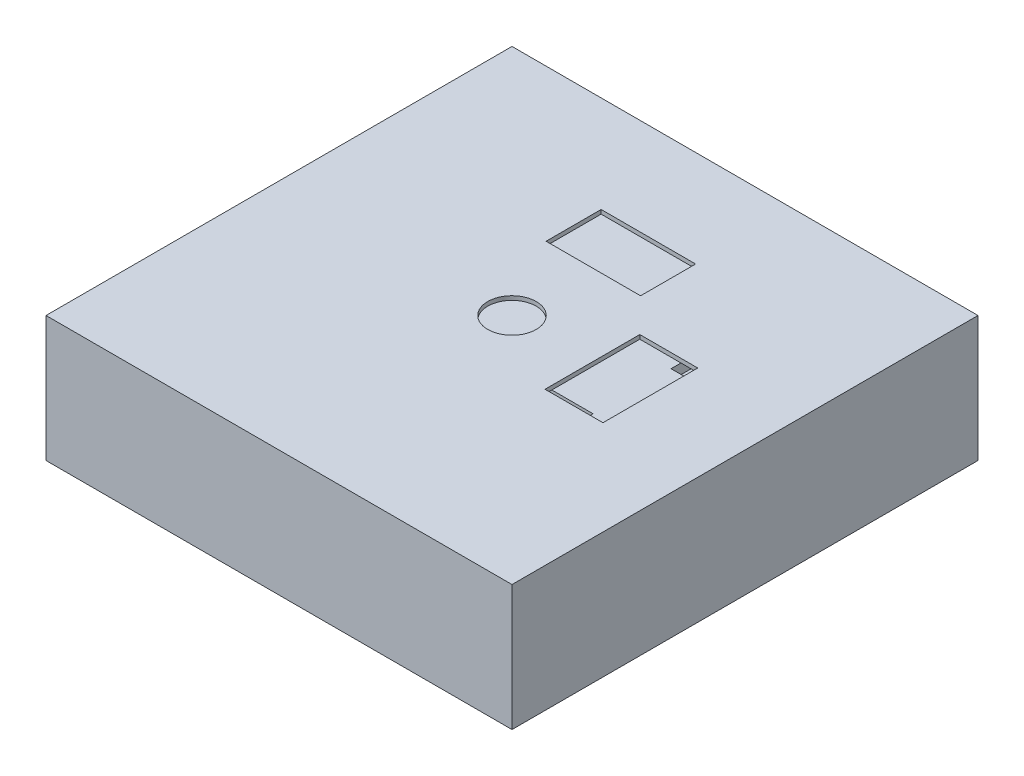
ISO-10303-21;
HEADER;
FILE_DESCRIPTION(('STEP AP214'),'2;1');
FILE_NAME('part.step','',(''),(''),'','','');
FILE_SCHEMA(('AUTOMOTIVE_DESIGN { 1 0 10303 214 1 1 1 1 }'));
ENDSEC;
DATA;
#1=APPLICATION_CONTEXT('core data for automotive mechanical design processes');
#2=APPLICATION_PROTOCOL_DEFINITION('international standard','automotive_design',2000,#1);
#3=PRODUCT_CONTEXT('',#1,'mechanical');
#4=PRODUCT('Part','Part','',(#3));
#5=PRODUCT_RELATED_PRODUCT_CATEGORY('part','',(#4));
#6=PRODUCT_DEFINITION_FORMATION('','',#4);
#7=PRODUCT_DEFINITION_CONTEXT('part definition',#1,'design');
#8=PRODUCT_DEFINITION('design','',#6,#7);
#9=PRODUCT_DEFINITION_SHAPE('','',#8);
#10=(LENGTH_UNIT() NAMED_UNIT(*) SI_UNIT(.MILLI.,.METRE.));
#11=(NAMED_UNIT(*) PLANE_ANGLE_UNIT() SI_UNIT($,.RADIAN.));
#12=(NAMED_UNIT(*) SI_UNIT($,.STERADIAN.) SOLID_ANGLE_UNIT());
#13=UNCERTAINTY_MEASURE_WITH_UNIT(LENGTH_MEASURE(1.E-05),#10,'distance_accuracy_value','');
#14=(GEOMETRIC_REPRESENTATION_CONTEXT(3) GLOBAL_UNCERTAINTY_ASSIGNED_CONTEXT((#13)) GLOBAL_UNIT_ASSIGNED_CONTEXT((#10,
#11,#12)) REPRESENTATION_CONTEXT('',''));
#15=CARTESIAN_POINT('',(0.,0.,0.));
#16=DIRECTION('',(0.,0.,1.));
#17=DIRECTION('',(1.,0.,0.));
#18=AXIS2_PLACEMENT_3D('',#15,#16,#17);
#19=CARTESIAN_POINT('',(0.,20.,0.));
#20=DIRECTION('',(0.,1.,0.));
#21=DIRECTION('',(0.,0.,1.));
#22=AXIS2_PLACEMENT_3D('',#19,#20,#21);
#23=PLANE('',#22);
#24=DIRECTION('',(0.,0.,-1.));
#25=VECTOR('',#24,1.);
#26=CARTESIAN_POINT('',(110.,20.,0.));
#27=LINE('',#26,#25);
#28=CARTESIAN_POINT('',(110.,20.,110.));
#29=VERTEX_POINT('',#28);
#30=CARTESIAN_POINT('',(110.,20.,-110.));
#31=VERTEX_POINT('',#30);
#32=EDGE_CURVE('E294',#29,#31,#27,.T.);
#33=ORIENTED_EDGE('',*,*,#32,.T.);
#34=DIRECTION('',(1.,0.,0.));
#35=VECTOR('',#34,1.);
#36=CARTESIAN_POINT('',(0.,20.,-110.));
#37=LINE('',#36,#35);
#38=CARTESIAN_POINT('',(-110.,20.,-110.));
#39=VERTEX_POINT('',#38);
#40=EDGE_CURVE('E298',#39,#31,#37,.T.);
#41=ORIENTED_EDGE('',*,*,#40,.F.);
#42=DIRECTION('',(0.,0.,-1.));
#43=VECTOR('',#42,1.);
#44=CARTESIAN_POINT('',(-110.,20.,0.));
#45=LINE('',#44,#43);
#46=CARTESIAN_POINT('',(-110.,20.,110.));
#47=VERTEX_POINT('',#46);
#48=EDGE_CURVE('E312',#47,#39,#45,.T.);
#49=ORIENTED_EDGE('',*,*,#48,.F.);
#50=DIRECTION('',(-1.,0.,0.));
#51=VECTOR('',#50,1.);
#52=CARTESIAN_POINT('',(0.,20.,110.));
#53=LINE('',#52,#51);
#54=EDGE_CURVE('E310',#29,#47,#53,.T.);
#55=ORIENTED_EDGE('',*,*,#54,.F.);
#56=EDGE_LOOP('',(#33,#41,#49,#55));
#57=FACE_BOUND('',#56,.T.);
#58=DIRECTION('',(0.,0.,1.));
#59=VECTOR('',#58,1.);
#60=CARTESIAN_POINT('',(-20.0000000000001,20.,-20.));
#61=LINE('',#60,#59);
#62=CARTESIAN_POINT('',(-20.0000000000001,20.,-20.));
#63=VERTEX_POINT('',#62);
#64=CARTESIAN_POINT('',(-20.0000000000001,20.,20.));
#65=VERTEX_POINT('',#64);
#66=EDGE_CURVE('E386',#63,#65,#61,.T.);
#67=ORIENTED_EDGE('',*,*,#66,.F.);
#68=DIRECTION('',(-1.,0.,0.));
#69=VECTOR('',#68,1.);
#70=CARTESIAN_POINT('',(-20.0000000000001,20.,-20.));
#71=LINE('',#70,#69);
#72=CARTESIAN_POINT('',(19.9999999999999,20.,-20.));
#73=VERTEX_POINT('',#72);
#74=EDGE_CURVE('E417',#73,#63,#71,.T.);
#75=ORIENTED_EDGE('',*,*,#74,.F.);
#76=DIRECTION('',(0.,0.,-1.));
#77=VECTOR('',#76,1.);
#78=CARTESIAN_POINT('',(19.9999999999999,20.,-20.));
#79=LINE('',#78,#77);
#80=CARTESIAN_POINT('',(19.9999999999999,20.,20.));
#81=VERTEX_POINT('',#80);
#82=EDGE_CURVE('E420',#81,#73,#79,.T.);
#83=ORIENTED_EDGE('',*,*,#82,.F.);
#84=DIRECTION('',(1.,0.,0.));
#85=VECTOR('',#84,1.);
#86=CARTESIAN_POINT('',(-20.0000000000001,20.,20.));
#87=LINE('',#86,#85);
#88=EDGE_CURVE('E423',#65,#81,#87,.T.);
#89=ORIENTED_EDGE('',*,*,#88,.F.);
#90=EDGE_LOOP('',(#67,#75,#83,#89));
#91=FACE_BOUND('',#90,.T.);
#92=DIRECTION('',(0.,0.,1.));
#93=VECTOR('',#92,1.);
#94=CARTESIAN_POINT('',(58.4999999999999,20.,20.));
#95=LINE('',#94,#93);
#96=CARTESIAN_POINT('',(58.4999999999999,20.,20.));
#97=VERTEX_POINT('',#96);
#98=CARTESIAN_POINT('',(58.4999999999999,20.,35.));
#99=VERTEX_POINT('',#98);
#100=EDGE_CURVE('E363',#97,#99,#95,.T.);
#101=ORIENTED_EDGE('',*,*,#100,.F.);
#102=DIRECTION('',(-1.,0.,0.));
#103=VECTOR('',#102,1.);
#104=CARTESIAN_POINT('',(58.4999999999999,20.,20.));
#105=LINE('',#104,#103);
#106=CARTESIAN_POINT('',(88.4999999999999,20.,20.));
#107=VERTEX_POINT('',#106);
#108=EDGE_CURVE('E387',#107,#97,#105,.T.);
#109=ORIENTED_EDGE('',*,*,#108,.F.);
#110=DIRECTION('',(0.,0.,-1.));
#111=VECTOR('',#110,1.);
#112=CARTESIAN_POINT('',(88.4999999999999,20.,20.));
#113=LINE('',#112,#111);
#114=CARTESIAN_POINT('',(88.4999999999999,20.,35.));
#115=VERTEX_POINT('',#114);
#116=EDGE_CURVE('E390',#115,#107,#113,.T.);
#117=ORIENTED_EDGE('',*,*,#116,.F.);
#118=DIRECTION('',(1.,0.,0.));
#119=VECTOR('',#118,1.);
#120=CARTESIAN_POINT('',(58.4999999999999,20.,35.));
#121=LINE('',#120,#119);
#122=EDGE_CURVE('E394',#99,#115,#121,.T.);
#123=ORIENTED_EDGE('',*,*,#122,.F.);
#124=EDGE_LOOP('',(#101,#109,#117,#123));
#125=FACE_BOUND('',#124,.T.);
#126=DIRECTION('',(0.,0.,1.));
#127=VECTOR('',#126,1.);
#128=CARTESIAN_POINT('',(19.9999999999999,20.,-88.5));
#129=LINE('',#128,#127);
#130=CARTESIAN_POINT('',(19.9999999999999,20.,-88.5));
#131=VERTEX_POINT('',#130);
#132=CARTESIAN_POINT('',(20.,20.,-58.5));
#133=VERTEX_POINT('',#132);
#134=EDGE_CURVE('E360',#131,#133,#129,.T.);
#135=ORIENTED_EDGE('',*,*,#134,.F.);
#136=DIRECTION('',(-1.,0.,0.));
#137=VECTOR('',#136,1.);
#138=CARTESIAN_POINT('',(19.9999999999999,20.,-88.5));
#139=LINE('',#138,#137);
#140=CARTESIAN_POINT('',(35.,20.,-88.5));
#141=VERTEX_POINT('',#140);
#142=EDGE_CURVE('E350',#141,#131,#139,.T.);
#143=ORIENTED_EDGE('',*,*,#142,.F.);
#144=DIRECTION('',(0.,0.,-1.));
#145=VECTOR('',#144,1.);
#146=CARTESIAN_POINT('',(35.,20.,-88.5));
#147=LINE('',#146,#145);
#148=CARTESIAN_POINT('',(35.,20.,-58.5));
#149=VERTEX_POINT('',#148);
#150=EDGE_CURVE('E366',#149,#141,#147,.T.);
#151=ORIENTED_EDGE('',*,*,#150,.F.);
#152=DIRECTION('',(1.,0.,0.));
#153=VECTOR('',#152,1.);
#154=CARTESIAN_POINT('',(20.,20.,-58.5));
#155=LINE('',#154,#153);
#156=EDGE_CURVE('E362',#133,#149,#155,.T.);
#157=ORIENTED_EDGE('',*,*,#156,.F.);
#158=EDGE_LOOP('',(#135,#143,#151,#157));
#159=FACE_BOUND('',#158,.T.);
#160=ADVANCED_FACE('F39',(#57,#91,#125,#159),#23,.T.);
#161=CARTESIAN_POINT('',(-20.0000000000001,15.,-20.));
#162=DIRECTION('',(-1.,0.,0.));
#163=DIRECTION('',(0.,0.,1.));
#164=AXIS2_PLACEMENT_3D('',#161,#162,#163);
#165=PLANE('',#164);
#166=ORIENTED_EDGE('',*,*,#66,.T.);
#167=DIRECTION('',(0.,1.,0.));
#168=VECTOR('',#167,1.);
#169=CARTESIAN_POINT('',(-20.0000000000001,15.,20.));
#170=LINE('',#169,#168);
#171=CARTESIAN_POINT('',(-20.0000000000001,15.,20.));
#172=VERTEX_POINT('',#171);
#173=EDGE_CURVE('E408',#172,#65,#170,.T.);
#174=ORIENTED_EDGE('',*,*,#173,.F.);
#175=DIRECTION('',(0.,0.,1.));
#176=VECTOR('',#175,1.);
#177=CARTESIAN_POINT('',(-20.0000000000001,15.,-20.));
#178=LINE('',#177,#176);
#179=CARTESIAN_POINT('',(-20.0000000000001,15.,-20.));
#180=VERTEX_POINT('',#179);
#181=EDGE_CURVE('E43',#180,#172,#178,.T.);
#182=ORIENTED_EDGE('',*,*,#181,.F.);
#183=DIRECTION('',(0.,1.,0.));
#184=VECTOR('',#183,1.);
#185=CARTESIAN_POINT('',(-20.0000000000001,15.,-20.));
#186=LINE('',#185,#184);
#187=EDGE_CURVE('E338',#180,#63,#186,.T.);
#188=ORIENTED_EDGE('',*,*,#187,.T.);
#189=EDGE_LOOP('',(#166,#174,#182,#188));
#190=FACE_BOUND('',#189,.T.);
#191=ADVANCED_FACE('F440',(#190),#165,.F.);
#192=CARTESIAN_POINT('',(-20.0000000000001,15.,-20.));
#193=DIRECTION('',(0.,0.,-1.));
#194=DIRECTION('',(-1.,0.,0.));
#195=AXIS2_PLACEMENT_3D('',#192,#193,#194);
#196=PLANE('',#195);
#197=ORIENTED_EDGE('',*,*,#74,.T.);
#198=ORIENTED_EDGE('',*,*,#187,.F.);
#199=DIRECTION('',(-1.,0.,0.));
#200=VECTOR('',#199,1.);
#201=CARTESIAN_POINT('',(-20.0000000000001,15.,-20.));
#202=LINE('',#201,#200);
#203=CARTESIAN_POINT('',(19.9999999999999,15.,-20.));
#204=VERTEX_POINT('',#203);
#205=EDGE_CURVE('E411',#204,#180,#202,.T.);
#206=ORIENTED_EDGE('',*,*,#205,.F.);
#207=DIRECTION('',(0.,1.,0.));
#208=VECTOR('',#207,1.);
#209=CARTESIAN_POINT('',(19.9999999999999,15.,-20.));
#210=LINE('',#209,#208);
#211=EDGE_CURVE('E414',#204,#73,#210,.T.);
#212=ORIENTED_EDGE('',*,*,#211,.T.);
#213=EDGE_LOOP('',(#197,#198,#206,#212));
#214=FACE_BOUND('',#213,.T.);
#215=ADVANCED_FACE('F450',(#214),#196,.F.);
#216=CARTESIAN_POINT('',(19.9999999999999,15.,-20.));
#217=DIRECTION('',(1.,0.,0.));
#218=DIRECTION('',(0.,0.,-1.));
#219=AXIS2_PLACEMENT_3D('',#216,#217,#218);
#220=PLANE('',#219);
#221=ORIENTED_EDGE('',*,*,#82,.T.);
#222=ORIENTED_EDGE('',*,*,#211,.F.);
#223=DIRECTION('',(0.,0.,-1.));
#224=VECTOR('',#223,1.);
#225=CARTESIAN_POINT('',(19.9999999999999,15.,-20.));
#226=LINE('',#225,#224);
#227=CARTESIAN_POINT('',(19.9999999999999,15.,20.));
#228=VERTEX_POINT('',#227);
#229=EDGE_CURVE('E429',#228,#204,#226,.T.);
#230=ORIENTED_EDGE('',*,*,#229,.F.);
#231=DIRECTION('',(0.,1.,0.));
#232=VECTOR('',#231,1.);
#233=CARTESIAN_POINT('',(19.9999999999999,15.,20.));
#234=LINE('',#233,#232);
#235=EDGE_CURVE('E412',#228,#81,#234,.T.);
#236=ORIENTED_EDGE('',*,*,#235,.T.);
#237=EDGE_LOOP('',(#221,#222,#230,#236));
#238=FACE_BOUND('',#237,.T.);
#239=ADVANCED_FACE('F448',(#238),#220,.F.);
#240=CARTESIAN_POINT('',(-20.0000000000001,15.,20.));
#241=DIRECTION('',(0.,0.,1.));
#242=DIRECTION('',(1.,0.,0.));
#243=AXIS2_PLACEMENT_3D('',#240,#241,#242);
#244=PLANE('',#243);
#245=ORIENTED_EDGE('',*,*,#88,.T.);
#246=ORIENTED_EDGE('',*,*,#235,.F.);
#247=DIRECTION('',(1.,0.,0.));
#248=VECTOR('',#247,1.);
#249=CARTESIAN_POINT('',(-20.0000000000001,15.,20.));
#250=LINE('',#249,#248);
#251=EDGE_CURVE('E431',#172,#228,#250,.T.);
#252=ORIENTED_EDGE('',*,*,#251,.F.);
#253=ORIENTED_EDGE('',*,*,#173,.T.);
#254=EDGE_LOOP('',(#245,#246,#252,#253));
#255=FACE_BOUND('',#254,.T.);
#256=ADVANCED_FACE('F444',(#255),#244,.F.);
#257=CARTESIAN_POINT('',(0.,15.,0.));
#258=DIRECTION('',(0.,1.,0.));
#259=DIRECTION('',(0.,0.,1.));
#260=AXIS2_PLACEMENT_3D('',#257,#258,#259);
#261=PLANE('',#260);
#262=ORIENTED_EDGE('',*,*,#181,.T.);
#263=ORIENTED_EDGE('',*,*,#251,.T.);
#264=ORIENTED_EDGE('',*,*,#229,.T.);
#265=ORIENTED_EDGE('',*,*,#205,.T.);
#266=EDGE_LOOP('',(#262,#263,#264,#265));
#267=FACE_BOUND('',#266,.T.);
#268=ADVANCED_FACE('F437',(#267),#261,.T.);
#269=CARTESIAN_POINT('',(58.4999999999999,15.,20.));
#270=DIRECTION('',(-1.,0.,0.));
#271=DIRECTION('',(0.,0.,1.));
#272=AXIS2_PLACEMENT_3D('',#269,#270,#271);
#273=PLANE('',#272);
#274=ORIENTED_EDGE('',*,*,#100,.T.);
#275=DIRECTION('',(0.,1.,0.));
#276=VECTOR('',#275,1.);
#277=CARTESIAN_POINT('',(58.4999999999999,15.,35.));
#278=LINE('',#277,#276);
#279=CARTESIAN_POINT('',(58.4999999999999,15.,35.));
#280=VERTEX_POINT('',#279);
#281=EDGE_CURVE('E376',#280,#99,#278,.T.);
#282=ORIENTED_EDGE('',*,*,#281,.F.);
#283=DIRECTION('',(0.,0.,1.));
#284=VECTOR('',#283,1.);
#285=CARTESIAN_POINT('',(58.4999999999999,15.,20.));
#286=LINE('',#285,#284);
#287=CARTESIAN_POINT('',(58.4999999999999,15.,20.));
#288=VERTEX_POINT('',#287);
#289=EDGE_CURVE('E391',#288,#280,#286,.T.);
#290=ORIENTED_EDGE('',*,*,#289,.F.);
#291=DIRECTION('',(0.,1.,0.));
#292=VECTOR('',#291,1.);
#293=CARTESIAN_POINT('',(58.4999999999999,15.,20.));
#294=LINE('',#293,#292);
#295=EDGE_CURVE('E384',#288,#97,#294,.T.);
#296=ORIENTED_EDGE('',*,*,#295,.T.);
#297=EDGE_LOOP('',(#274,#282,#290,#296));
#298=FACE_BOUND('',#297,.T.);
#299=ADVANCED_FACE('F491',(#298),#273,.F.);
#300=CARTESIAN_POINT('',(58.4999999999999,15.,20.));
#301=DIRECTION('',(0.,0.,-1.));
#302=DIRECTION('',(-1.,0.,0.));
#303=AXIS2_PLACEMENT_3D('',#300,#301,#302);
#304=PLANE('',#303);
#305=ORIENTED_EDGE('',*,*,#108,.T.);
#306=ORIENTED_EDGE('',*,*,#295,.F.);
#307=DIRECTION('',(-1.,0.,0.));
#308=VECTOR('',#307,1.);
#309=CARTESIAN_POINT('',(58.4999999999999,15.,20.));
#310=LINE('',#309,#308);
#311=CARTESIAN_POINT('',(88.4999999999999,15.,20.));
#312=VERTEX_POINT('',#311);
#313=EDGE_CURVE('E379',#312,#288,#310,.T.);
#314=ORIENTED_EDGE('',*,*,#313,.F.);
#315=DIRECTION('',(0.,1.,0.));
#316=VECTOR('',#315,1.);
#317=CARTESIAN_POINT('',(88.4999999999999,15.,20.));
#318=LINE('',#317,#316);
#319=EDGE_CURVE('E382',#312,#107,#318,.T.);
#320=ORIENTED_EDGE('',*,*,#319,.T.);
#321=EDGE_LOOP('',(#305,#306,#314,#320));
#322=FACE_BOUND('',#321,.T.);
#323=ADVANCED_FACE('F494',(#322),#304,.F.);
#324=CARTESIAN_POINT('',(88.4999999999999,15.,20.));
#325=DIRECTION('',(1.,0.,0.));
#326=DIRECTION('',(0.,0.,-1.));
#327=AXIS2_PLACEMENT_3D('',#324,#325,#326);
#328=PLANE('',#327);
#329=ORIENTED_EDGE('',*,*,#116,.T.);
#330=ORIENTED_EDGE('',*,*,#319,.F.);
#331=DIRECTION('',(0.,0.,-1.));
#332=VECTOR('',#331,1.);
#333=CARTESIAN_POINT('',(88.4999999999999,15.,20.));
#334=LINE('',#333,#332);
#335=CARTESIAN_POINT('',(88.4999999999999,15.,35.));
#336=VERTEX_POINT('',#335);
#337=EDGE_CURVE('E400',#336,#312,#334,.T.);
#338=ORIENTED_EDGE('',*,*,#337,.F.);
#339=DIRECTION('',(0.,1.,0.));
#340=VECTOR('',#339,1.);
#341=CARTESIAN_POINT('',(88.4999999999999,15.,35.));
#342=LINE('',#341,#340);
#343=EDGE_CURVE('E380',#336,#115,#342,.T.);
#344=ORIENTED_EDGE('',*,*,#343,.T.);
#345=EDGE_LOOP('',(#329,#330,#338,#344));
#346=FACE_BOUND('',#345,.T.);
#347=ADVANCED_FACE('F499',(#346),#328,.F.);
#348=CARTESIAN_POINT('',(58.4999999999999,15.,35.));
#349=DIRECTION('',(0.,0.,1.));
#350=DIRECTION('',(1.,0.,0.));
#351=AXIS2_PLACEMENT_3D('',#348,#349,#350);
#352=PLANE('',#351);
#353=ORIENTED_EDGE('',*,*,#122,.T.);
#354=ORIENTED_EDGE('',*,*,#343,.F.);
#355=DIRECTION('',(1.,0.,0.));
#356=VECTOR('',#355,1.);
#357=CARTESIAN_POINT('',(58.4999999999999,15.,35.));
#358=LINE('',#357,#356);
#359=EDGE_CURVE('E403',#280,#336,#358,.T.);
#360=ORIENTED_EDGE('',*,*,#359,.F.);
#361=ORIENTED_EDGE('',*,*,#281,.T.);
#362=EDGE_LOOP('',(#353,#354,#360,#361));
#363=FACE_BOUND('',#362,.T.);
#364=ADVANCED_FACE('F496',(#363),#352,.F.);
#365=CARTESIAN_POINT('',(0.,15.,0.));
#366=DIRECTION('',(0.,1.,0.));
#367=DIRECTION('',(0.,0.,1.));
#368=AXIS2_PLACEMENT_3D('',#365,#366,#367);
#369=PLANE('',#368);
#370=ORIENTED_EDGE('',*,*,#289,.T.);
#371=ORIENTED_EDGE('',*,*,#359,.T.);
#372=ORIENTED_EDGE('',*,*,#337,.T.);
#373=ORIENTED_EDGE('',*,*,#313,.T.);
#374=EDGE_LOOP('',(#370,#371,#372,#373));
#375=FACE_BOUND('',#374,.T.);
#376=ADVANCED_FACE('F490',(#375),#369,.T.);
#377=CARTESIAN_POINT('',(19.9999999999999,15.,-88.5));
#378=DIRECTION('',(-1.,0.,0.));
#379=DIRECTION('',(0.,0.,1.));
#380=AXIS2_PLACEMENT_3D('',#377,#378,#379);
#381=PLANE('',#380);
#382=ORIENTED_EDGE('',*,*,#134,.T.);
#383=DIRECTION('',(0.,1.,0.));
#384=VECTOR('',#383,1.);
#385=CARTESIAN_POINT('',(20.,15.,-58.5));
#386=LINE('',#385,#384);
#387=CARTESIAN_POINT('',(20.,15.,-58.5));
#388=VERTEX_POINT('',#387);
#389=EDGE_CURVE('E359',#388,#133,#386,.T.);
#390=ORIENTED_EDGE('',*,*,#389,.F.);
#391=DIRECTION('',(0.,0.,1.));
#392=VECTOR('',#391,1.);
#393=CARTESIAN_POINT('',(19.9999999999999,15.,-88.5));
#394=LINE('',#393,#392);
#395=CARTESIAN_POINT('',(19.9999999999999,15.,-88.5));
#396=VERTEX_POINT('',#395);
#397=EDGE_CURVE('E346',#396,#388,#394,.T.);
#398=ORIENTED_EDGE('',*,*,#397,.F.);
#399=DIRECTION('',(0.,1.,0.));
#400=VECTOR('',#399,1.);
#401=CARTESIAN_POINT('',(19.9999999999999,15.,-88.5));
#402=LINE('',#401,#400);
#403=EDGE_CURVE('E11',#396,#131,#402,.T.);
#404=ORIENTED_EDGE('',*,*,#403,.T.);
#405=EDGE_LOOP('',(#382,#390,#398,#404));
#406=FACE_BOUND('',#405,.T.);
#407=ADVANCED_FACE('F465',(#406),#381,.F.);
#408=CARTESIAN_POINT('',(19.9999999999999,15.,-88.5));
#409=DIRECTION('',(0.,0.,-1.));
#410=DIRECTION('',(-1.,0.,0.));
#411=AXIS2_PLACEMENT_3D('',#408,#409,#410);
#412=PLANE('',#411);
#413=ORIENTED_EDGE('',*,*,#142,.T.);
#414=ORIENTED_EDGE('',*,*,#403,.F.);
#415=DIRECTION('',(-1.,0.,0.));
#416=VECTOR('',#415,1.);
#417=CARTESIAN_POINT('',(19.9999999999999,15.,-88.5));
#418=LINE('',#417,#416);
#419=CARTESIAN_POINT('',(35.,15.,-88.5));
#420=VERTEX_POINT('',#419);
#421=EDGE_CURVE('E356',#420,#396,#418,.T.);
#422=ORIENTED_EDGE('',*,*,#421,.F.);
#423=DIRECTION('',(0.,1.,0.));
#424=VECTOR('',#423,1.);
#425=CARTESIAN_POINT('',(35.,15.,-88.5));
#426=LINE('',#425,#424);
#427=EDGE_CURVE('E48',#420,#141,#426,.T.);
#428=ORIENTED_EDGE('',*,*,#427,.T.);
#429=EDGE_LOOP('',(#413,#414,#422,#428));
#430=FACE_BOUND('',#429,.T.);
#431=ADVANCED_FACE('F475',(#430),#412,.F.);
#432=CARTESIAN_POINT('',(35.,15.,-88.5));
#433=DIRECTION('',(1.,0.,0.));
#434=DIRECTION('',(0.,0.,-1.));
#435=AXIS2_PLACEMENT_3D('',#432,#433,#434);
#436=PLANE('',#435);
#437=ORIENTED_EDGE('',*,*,#150,.T.);
#438=ORIENTED_EDGE('',*,*,#427,.F.);
#439=DIRECTION('',(0.,0.,-1.));
#440=VECTOR('',#439,1.);
#441=CARTESIAN_POINT('',(35.,15.,-88.5));
#442=LINE('',#441,#440);
#443=CARTESIAN_POINT('',(35.,15.,-58.5));
#444=VERTEX_POINT('',#443);
#445=EDGE_CURVE('E353',#444,#420,#442,.T.);
#446=ORIENTED_EDGE('',*,*,#445,.F.);
#447=DIRECTION('',(0.,1.,0.));
#448=VECTOR('',#447,1.);
#449=CARTESIAN_POINT('',(35.,15.,-58.5));
#450=LINE('',#449,#448);
#451=EDGE_CURVE('E372',#444,#149,#450,.T.);
#452=ORIENTED_EDGE('',*,*,#451,.T.);
#453=EDGE_LOOP('',(#437,#438,#446,#452));
#454=FACE_BOUND('',#453,.T.);
#455=ADVANCED_FACE('F477',(#454),#436,.F.);
#456=CARTESIAN_POINT('',(20.,15.,-58.5));
#457=DIRECTION('',(0.,0.,1.));
#458=DIRECTION('',(1.,0.,0.));
#459=AXIS2_PLACEMENT_3D('',#456,#457,#458);
#460=PLANE('',#459);
#461=ORIENTED_EDGE('',*,*,#156,.T.);
#462=ORIENTED_EDGE('',*,*,#451,.F.);
#463=DIRECTION('',(1.,0.,0.));
#464=VECTOR('',#463,1.);
#465=CARTESIAN_POINT('',(20.,15.,-58.5));
#466=LINE('',#465,#464);
#467=EDGE_CURVE('E349',#388,#444,#466,.T.);
#468=ORIENTED_EDGE('',*,*,#467,.F.);
#469=ORIENTED_EDGE('',*,*,#389,.T.);
#470=EDGE_LOOP('',(#461,#462,#468,#469));
#471=FACE_BOUND('',#470,.T.);
#472=ADVANCED_FACE('F469',(#471),#460,.F.);
#473=CARTESIAN_POINT('',(0.,15.,0.));
#474=DIRECTION('',(0.,1.,0.));
#475=DIRECTION('',(0.,0.,1.));
#476=AXIS2_PLACEMENT_3D('',#473,#474,#475);
#477=PLANE('',#476);
#478=ORIENTED_EDGE('',*,*,#397,.T.);
#479=ORIENTED_EDGE('',*,*,#467,.T.);
#480=ORIENTED_EDGE('',*,*,#445,.T.);
#481=ORIENTED_EDGE('',*,*,#421,.T.);
#482=EDGE_LOOP('',(#478,#479,#480,#481));
#483=FACE_BOUND('',#482,.T.);
#484=ADVANCED_FACE('F472',(#483),#477,.T.);
#485=CARTESIAN_POINT('',(110.,60.,0.));
#486=DIRECTION('',(-1.,0.,0.));
#487=DIRECTION('',(0.,0.,1.));
#488=AXIS2_PLACEMENT_3D('',#485,#486,#487);
#489=PLANE('',#488);
#490=ORIENTED_EDGE('',*,*,#32,.F.);
#491=DIRECTION('',(0.,-1.,0.));
#492=VECTOR('',#491,1.);
#493=CARTESIAN_POINT('',(110.,60.,110.));
#494=LINE('',#493,#492);
#495=CARTESIAN_POINT('',(110.,60.,110.));
#496=VERTEX_POINT('',#495);
#497=EDGE_CURVE('E323',#496,#29,#494,.T.);
#498=ORIENTED_EDGE('',*,*,#497,.F.);
#499=DIRECTION('',(0.,0.,-1.));
#500=VECTOR('',#499,1.);
#501=CARTESIAN_POINT('',(110.,60.,0.));
#502=LINE('',#501,#500);
#503=CARTESIAN_POINT('',(110.,60.,-110.));
#504=VERTEX_POINT('',#503);
#505=EDGE_CURVE('E295',#496,#504,#502,.T.);
#506=ORIENTED_EDGE('',*,*,#505,.T.);
#507=DIRECTION('',(0.,-1.,0.));
#508=VECTOR('',#507,1.);
#509=CARTESIAN_POINT('',(110.,60.,-110.));
#510=LINE('',#509,#508);
#511=EDGE_CURVE('E307',#504,#31,#510,.T.);
#512=ORIENTED_EDGE('',*,*,#511,.T.);
#513=EDGE_LOOP('',(#490,#498,#506,#512));
#514=FACE_BOUND('',#513,.T.);
#515=ADVANCED_FACE('F578',(#514),#489,.T.);
#516=CARTESIAN_POINT('',(0.,60.,110.));
#517=DIRECTION('',(0.,0.,1.));
#518=DIRECTION('',(1.,0.,0.));
#519=AXIS2_PLACEMENT_3D('',#516,#517,#518);
#520=PLANE('',#519);
#521=ORIENTED_EDGE('',*,*,#54,.T.);
#522=DIRECTION('',(0.,-1.,0.));
#523=VECTOR('',#522,1.);
#524=CARTESIAN_POINT('',(-110.,60.,110.));
#525=LINE('',#524,#523);
#526=CARTESIAN_POINT('',(-110.,60.,110.));
#527=VERTEX_POINT('',#526);
#528=EDGE_CURVE('E320',#527,#47,#525,.T.);
#529=ORIENTED_EDGE('',*,*,#528,.F.);
#530=DIRECTION('',(-1.,0.,0.));
#531=VECTOR('',#530,1.);
#532=CARTESIAN_POINT('',(0.,60.,110.));
#533=LINE('',#532,#531);
#534=EDGE_CURVE('E297',#496,#527,#533,.T.);
#535=ORIENTED_EDGE('',*,*,#534,.F.);
#536=ORIENTED_EDGE('',*,*,#497,.T.);
#537=EDGE_LOOP('',(#521,#529,#535,#536));
#538=FACE_BOUND('',#537,.T.);
#539=ADVANCED_FACE('F675',(#538),#520,.F.);
#540=CARTESIAN_POINT('',(-110.,60.,0.));
#541=DIRECTION('',(-1.,0.,0.));
#542=DIRECTION('',(0.,0.,1.));
#543=AXIS2_PLACEMENT_3D('',#540,#541,#542);
#544=PLANE('',#543);
#545=ORIENTED_EDGE('',*,*,#48,.T.);
#546=DIRECTION('',(0.,-1.,0.));
#547=VECTOR('',#546,1.);
#548=CARTESIAN_POINT('',(-110.,60.,-110.));
#549=LINE('',#548,#547);
#550=CARTESIAN_POINT('',(-110.,60.,-110.));
#551=VERTEX_POINT('',#550);
#552=EDGE_CURVE('E318',#551,#39,#549,.T.);
#553=ORIENTED_EDGE('',*,*,#552,.F.);
#554=DIRECTION('',(0.,0.,-1.));
#555=VECTOR('',#554,1.);
#556=CARTESIAN_POINT('',(-110.,60.,0.));
#557=LINE('',#556,#555);
#558=EDGE_CURVE('E301',#527,#551,#557,.T.);
#559=ORIENTED_EDGE('',*,*,#558,.F.);
#560=ORIENTED_EDGE('',*,*,#528,.T.);
#561=EDGE_LOOP('',(#545,#553,#559,#560));
#562=FACE_BOUND('',#561,.T.);
#563=ADVANCED_FACE('F685',(#562),#544,.F.);
#564=CARTESIAN_POINT('',(0.,60.,-110.));
#565=DIRECTION('',(0.,0.,-1.));
#566=DIRECTION('',(-1.,0.,0.));
#567=AXIS2_PLACEMENT_3D('',#564,#565,#566);
#568=PLANE('',#567);
#569=ORIENTED_EDGE('',*,*,#40,.T.);
#570=ORIENTED_EDGE('',*,*,#511,.F.);
#571=DIRECTION('',(1.,0.,0.));
#572=VECTOR('',#571,1.);
#573=CARTESIAN_POINT('',(0.,60.,-110.));
#574=LINE('',#573,#572);
#575=EDGE_CURVE('E304',#551,#504,#574,.T.);
#576=ORIENTED_EDGE('',*,*,#575,.F.);
#577=ORIENTED_EDGE('',*,*,#552,.T.);
#578=EDGE_LOOP('',(#569,#570,#576,#577));
#579=FACE_BOUND('',#578,.T.);
#580=ADVANCED_FACE('F694',(#579),#568,.F.);
#581=CARTESIAN_POINT('',(0.,60.,0.));
#582=DIRECTION('',(0.,1.,0.));
#583=DIRECTION('',(0.,0.,1.));
#584=AXIS2_PLACEMENT_3D('',#581,#582,#583);
#585=PLANE('',#584);
#586=CARTESIAN_POINT('',(0.,60.,0.));
#587=DIRECTION('',(0.,1.,0.));
#588=DIRECTION('',(0.,0.,1.));
#589=AXIS2_PLACEMENT_3D('',#586,#587,#588);
#590=CIRCLE('',#589,11.9595104522743);
#591=CARTESIAN_POINT('',(0.,60.,11.9595104522743));
#592=VERTEX_POINT('',#591);
#593=EDGE_CURVE('E817',#592,#592,#590,.F.);
#594=ORIENTED_EDGE('',*,*,#593,.F.);
#595=EDGE_LOOP('',(#594));
#596=FACE_BOUND('',#595,.T.);
#597=DIRECTION('',(0.,0.,-1.));
#598=VECTOR('',#597,1.);
#599=CARTESIAN_POINT('',(39.6863011297414,60.,-23.3917396145855));
#600=LINE('',#599,#598);
#601=CARTESIAN_POINT('',(39.6863011297414,60.,23.3917396145855));
#602=VERTEX_POINT('',#601);
#603=CARTESIAN_POINT('',(39.6863011297414,60.,-23.3917396145855));
#604=VERTEX_POINT('',#603);
#605=EDGE_CURVE('E274',#602,#604,#600,.T.);
#606=ORIENTED_EDGE('',*,*,#605,.F.);
#607=DIRECTION('',(-1.,0.,0.));
#608=VECTOR('',#607,1.);
#609=CARTESIAN_POINT('',(39.6863011297414,60.,23.3917396145855));
#610=LINE('',#609,#608);
#611=CARTESIAN_POINT('',(68.2858127391491,60.,23.3917396145855));
#612=VERTEX_POINT('',#611);
#613=EDGE_CURVE('E253',#612,#602,#610,.T.);
#614=ORIENTED_EDGE('',*,*,#613,.F.);
#615=DIRECTION('',(0.,0.,1.));
#616=VECTOR('',#615,1.);
#617=CARTESIAN_POINT('',(68.2858127391491,60.,-23.3917396145855));
#618=LINE('',#617,#616);
#619=CARTESIAN_POINT('',(68.2858127391491,60.,-23.3917396145855));
#620=VERTEX_POINT('',#619);
#621=EDGE_CURVE('E280',#620,#612,#618,.T.);
#622=ORIENTED_EDGE('',*,*,#621,.F.);
#623=DIRECTION('',(1.,0.,0.));
#624=VECTOR('',#623,1.);
#625=CARTESIAN_POINT('',(39.6863011297414,60.,-23.3917396145855));
#626=LINE('',#625,#624);
#627=EDGE_CURVE('E277',#604,#620,#626,.T.);
#628=ORIENTED_EDGE('',*,*,#627,.F.);
#629=EDGE_LOOP('',(#606,#614,#622,#628));
#630=FACE_BOUND('',#629,.T.);
#631=DIRECTION('',(0.,0.,1.));
#632=VECTOR('',#631,1.);
#633=CARTESIAN_POINT('',(23.3169199013967,60.,-40.1493810738758));
#634=LINE('',#633,#632);
#635=CARTESIAN_POINT('',(23.3169199013967,60.,-67.3087316701589));
#636=VERTEX_POINT('',#635);
#637=CARTESIAN_POINT('',(23.3169199013967,60.,-40.1493810738758));
#638=VERTEX_POINT('',#637);
#639=EDGE_CURVE('E237',#636,#638,#634,.T.);
#640=ORIENTED_EDGE('',*,*,#639,.F.);
#641=DIRECTION('',(1.,0.,0.));
#642=VECTOR('',#641,1.);
#643=CARTESIAN_POINT('',(-23.3169199013967,60.,-67.3087316701589));
#644=LINE('',#643,#642);
#645=CARTESIAN_POINT('',(-23.3169199013967,60.,-67.3087316701589));
#646=VERTEX_POINT('',#645);
#647=EDGE_CURVE('E233',#646,#636,#644,.T.);
#648=ORIENTED_EDGE('',*,*,#647,.F.);
#649=DIRECTION('',(0.,0.,-1.));
#650=VECTOR('',#649,1.);
#651=CARTESIAN_POINT('',(-23.3169199013967,60.,-40.1493810738758));
#652=LINE('',#651,#650);
#653=CARTESIAN_POINT('',(-23.3169199013967,60.,-40.1493810738758));
#654=VERTEX_POINT('',#653);
#655=EDGE_CURVE('E247',#654,#646,#652,.T.);
#656=ORIENTED_EDGE('',*,*,#655,.F.);
#657=DIRECTION('',(-1.,0.,0.));
#658=VECTOR('',#657,1.);
#659=CARTESIAN_POINT('',(-23.3169199013967,60.,-40.1493810738758));
#660=LINE('',#659,#658);
#661=EDGE_CURVE('E227',#638,#654,#660,.T.);
#662=ORIENTED_EDGE('',*,*,#661,.F.);
#663=EDGE_LOOP('',(#640,#648,#656,#662));
#664=FACE_BOUND('',#663,.T.);
#665=ORIENTED_EDGE('',*,*,#505,.F.);
#666=ORIENTED_EDGE('',*,*,#534,.T.);
#667=ORIENTED_EDGE('',*,*,#558,.T.);
#668=ORIENTED_EDGE('',*,*,#575,.T.);
#669=EDGE_LOOP('',(#665,#666,#667,#668));
#670=FACE_BOUND('',#669,.T.);
#671=ADVANCED_FACE('F244',(#596,#630,#664,#670),#585,.F.);
#672=CARTESIAN_POINT('',(-23.3169199013967,-0.001000000000001,-67.3087316701589));
#673=DIRECTION('',(0.,0.,-1.));
#674=DIRECTION('',(-1.,0.,0.));
#675=AXIS2_PLACEMENT_3D('',#672,#673,#674);
#676=PLANE('',#675);
#677=ORIENTED_EDGE('',*,*,#647,.T.);
#678=DIRECTION('',(0.,1.,0.));
#679=VECTOR('',#678,1.);
#680=CARTESIAN_POINT('',(23.3169199013967,-0.001000000000001,-67.3087316701589));
#681=LINE('',#680,#679);
#682=CARTESIAN_POINT('',(23.3169199013967,62.,-67.3087316701589));
#683=VERTEX_POINT('',#682);
#684=EDGE_CURVE('E239',#636,#683,#681,.T.);
#685=ORIENTED_EDGE('',*,*,#684,.T.);
#686=DIRECTION('',(-1.,0.,0.));
#687=VECTOR('',#686,1.);
#688=CARTESIAN_POINT('',(-23.3169199013967,62.,-67.3087316701589));
#689=LINE('',#688,#687);
#690=CARTESIAN_POINT('',(-23.3169199013967,62.,-67.3087316701589));
#691=VERTEX_POINT('',#690);
#692=EDGE_CURVE('E830',#683,#691,#689,.T.);
#693=ORIENTED_EDGE('',*,*,#692,.T.);
#694=DIRECTION('',(0.,1.,0.));
#695=VECTOR('',#694,1.);
#696=CARTESIAN_POINT('',(-23.3169199013967,-0.001000000000001,-67.3087316701589));
#697=LINE('',#696,#695);
#698=EDGE_CURVE('E823',#646,#691,#697,.T.);
#699=ORIENTED_EDGE('',*,*,#698,.F.);
#700=EDGE_LOOP('',(#677,#685,#693,#699));
#701=FACE_BOUND('',#700,.T.);
#702=ADVANCED_FACE('F709',(#701),#676,.F.);
#703=CARTESIAN_POINT('',(-23.3169199013967,-0.001000000000001,-40.1493810738758));
#704=DIRECTION('',(-1.,0.,0.));
#705=DIRECTION('',(0.,0.,1.));
#706=AXIS2_PLACEMENT_3D('',#703,#704,#705);
#707=PLANE('',#706);
#708=ORIENTED_EDGE('',*,*,#655,.T.);
#709=ORIENTED_EDGE('',*,*,#698,.T.);
#710=DIRECTION('',(0.,0.,1.));
#711=VECTOR('',#710,1.);
#712=CARTESIAN_POINT('',(-23.3169199013967,62.,-40.1493810738758));
#713=LINE('',#712,#711);
#714=CARTESIAN_POINT('',(-23.3169199013967,62.,-40.1493810738758));
#715=VERTEX_POINT('',#714);
#716=EDGE_CURVE('E827',#691,#715,#713,.T.);
#717=ORIENTED_EDGE('',*,*,#716,.T.);
#718=DIRECTION('',(0.,1.,0.));
#719=VECTOR('',#718,1.);
#720=CARTESIAN_POINT('',(-23.3169199013967,-0.001000000000001,-40.1493810738758));
#721=LINE('',#720,#719);
#722=EDGE_CURVE('E232',#654,#715,#721,.T.);
#723=ORIENTED_EDGE('',*,*,#722,.F.);
#724=EDGE_LOOP('',(#708,#709,#717,#723));
#725=FACE_BOUND('',#724,.T.);
#726=ADVANCED_FACE('F713',(#725),#707,.F.);
#727=CARTESIAN_POINT('',(-23.3169199013967,-0.001000000000001,-40.1493810738758));
#728=DIRECTION('',(0.,0.,1.));
#729=DIRECTION('',(1.,0.,0.));
#730=AXIS2_PLACEMENT_3D('',#727,#728,#729);
#731=PLANE('',#730);
#732=ORIENTED_EDGE('',*,*,#661,.T.);
#733=ORIENTED_EDGE('',*,*,#722,.T.);
#734=DIRECTION('',(1.,0.,0.));
#735=VECTOR('',#734,1.);
#736=CARTESIAN_POINT('',(-23.3169199013967,62.,-40.1493810738758));
#737=LINE('',#736,#735);
#738=CARTESIAN_POINT('',(23.3169199013967,62.,-40.1493810738758));
#739=VERTEX_POINT('',#738);
#740=EDGE_CURVE('E64',#715,#739,#737,.T.);
#741=ORIENTED_EDGE('',*,*,#740,.T.);
#742=DIRECTION('',(0.,1.,0.));
#743=VECTOR('',#742,1.);
#744=CARTESIAN_POINT('',(23.3169199013967,-0.001000000000001,-40.1493810738758));
#745=LINE('',#744,#743);
#746=EDGE_CURVE('E223',#638,#739,#745,.T.);
#747=ORIENTED_EDGE('',*,*,#746,.F.);
#748=EDGE_LOOP('',(#732,#733,#741,#747));
#749=FACE_BOUND('',#748,.T.);
#750=ADVANCED_FACE('F225',(#749),#731,.F.);
#751=CARTESIAN_POINT('',(23.3169199013967,-0.001000000000001,-40.1493810738758));
#752=DIRECTION('',(1.,0.,0.));
#753=DIRECTION('',(0.,0.,-1.));
#754=AXIS2_PLACEMENT_3D('',#751,#752,#753);
#755=PLANE('',#754);
#756=ORIENTED_EDGE('',*,*,#639,.T.);
#757=ORIENTED_EDGE('',*,*,#746,.T.);
#758=DIRECTION('',(0.,0.,-1.));
#759=VECTOR('',#758,1.);
#760=CARTESIAN_POINT('',(23.3169199013967,62.,-40.1493810738758));
#761=LINE('',#760,#759);
#762=EDGE_CURVE('E242',#739,#683,#761,.T.);
#763=ORIENTED_EDGE('',*,*,#762,.T.);
#764=ORIENTED_EDGE('',*,*,#684,.F.);
#765=EDGE_LOOP('',(#756,#757,#763,#764));
#766=FACE_BOUND('',#765,.T.);
#767=ADVANCED_FACE('F238',(#766),#755,.F.);
#768=CARTESIAN_POINT('',(39.6863011297414,-0.001000000000001,23.3917396145855));
#769=DIRECTION('',(0.,0.,1.));
#770=DIRECTION('',(1.,0.,0.));
#771=AXIS2_PLACEMENT_3D('',#768,#769,#770);
#772=PLANE('',#771);
#773=ORIENTED_EDGE('',*,*,#613,.T.);
#774=DIRECTION('',(0.,1.,0.));
#775=VECTOR('',#774,1.);
#776=CARTESIAN_POINT('',(39.6863011297414,-0.001000000000001,23.3917396145855));
#777=LINE('',#776,#775);
#778=CARTESIAN_POINT('',(39.6863011297414,62.,23.3917396145855));
#779=VERTEX_POINT('',#778);
#780=EDGE_CURVE('E257',#602,#779,#777,.T.);
#781=ORIENTED_EDGE('',*,*,#780,.T.);
#782=DIRECTION('',(1.,0.,0.));
#783=VECTOR('',#782,1.);
#784=CARTESIAN_POINT('',(39.6863011297414,62.,23.3917396145855));
#785=LINE('',#784,#783);
#786=CARTESIAN_POINT('',(68.2858127391491,62.,23.3917396145855));
#787=VERTEX_POINT('',#786);
#788=EDGE_CURVE('E268',#779,#787,#785,.T.);
#789=ORIENTED_EDGE('',*,*,#788,.T.);
#790=DIRECTION('',(0.,1.,0.));
#791=VECTOR('',#790,1.);
#792=CARTESIAN_POINT('',(68.2858127391491,-0.001000000000001,23.3917396145855));
#793=LINE('',#792,#791);
#794=EDGE_CURVE('E259',#612,#787,#793,.T.);
#795=ORIENTED_EDGE('',*,*,#794,.F.);
#796=EDGE_LOOP('',(#773,#781,#789,#795));
#797=FACE_BOUND('',#796,.T.);
#798=ADVANCED_FACE('F738',(#797),#772,.F.);
#799=CARTESIAN_POINT('',(68.2858127391491,-0.001000000000001,-23.3917396145855));
#800=DIRECTION('',(1.,0.,0.));
#801=DIRECTION('',(0.,0.,-1.));
#802=AXIS2_PLACEMENT_3D('',#799,#800,#801);
#803=PLANE('',#802);
#804=ORIENTED_EDGE('',*,*,#621,.T.);
#805=ORIENTED_EDGE('',*,*,#794,.T.);
#806=DIRECTION('',(0.,0.,-1.));
#807=VECTOR('',#806,1.);
#808=CARTESIAN_POINT('',(68.2858127391491,62.,-23.3917396145855));
#809=LINE('',#808,#807);
#810=CARTESIAN_POINT('',(68.2858127391491,62.,-23.3917396145855));
#811=VERTEX_POINT('',#810);
#812=EDGE_CURVE('E265',#787,#811,#809,.T.);
#813=ORIENTED_EDGE('',*,*,#812,.T.);
#814=DIRECTION('',(0.,1.,0.));
#815=VECTOR('',#814,1.);
#816=CARTESIAN_POINT('',(68.2858127391491,-0.001000000000001,-23.3917396145855));
#817=LINE('',#816,#815);
#818=EDGE_CURVE('E261',#620,#811,#817,.T.);
#819=ORIENTED_EDGE('',*,*,#818,.F.);
#820=EDGE_LOOP('',(#804,#805,#813,#819));
#821=FACE_BOUND('',#820,.T.);
#822=ADVANCED_FACE('F746',(#821),#803,.F.);
#823=CARTESIAN_POINT('',(39.6863011297414,-0.001000000000001,-23.3917396145855));
#824=DIRECTION('',(0.,0.,-1.));
#825=DIRECTION('',(-1.,0.,0.));
#826=AXIS2_PLACEMENT_3D('',#823,#824,#825);
#827=PLANE('',#826);
#828=ORIENTED_EDGE('',*,*,#627,.T.);
#829=ORIENTED_EDGE('',*,*,#818,.T.);
#830=DIRECTION('',(-1.,0.,0.));
#831=VECTOR('',#830,1.);
#832=CARTESIAN_POINT('',(39.6863011297414,62.,-23.3917396145855));
#833=LINE('',#832,#831);
#834=CARTESIAN_POINT('',(39.6863011297414,62.,-23.3917396145855));
#835=VERTEX_POINT('',#834);
#836=EDGE_CURVE('E56',#811,#835,#833,.T.);
#837=ORIENTED_EDGE('',*,*,#836,.T.);
#838=DIRECTION('',(0.,1.,0.));
#839=VECTOR('',#838,1.);
#840=CARTESIAN_POINT('',(39.6863011297414,-0.001000000000001,-23.3917396145855));
#841=LINE('',#840,#839);
#842=EDGE_CURVE('E255',#604,#835,#841,.T.);
#843=ORIENTED_EDGE('',*,*,#842,.F.);
#844=EDGE_LOOP('',(#828,#829,#837,#843));
#845=FACE_BOUND('',#844,.T.);
#846=ADVANCED_FACE('F755',(#845),#827,.F.);
#847=CARTESIAN_POINT('',(39.6863011297414,-0.001000000000001,-23.3917396145855));
#848=DIRECTION('',(-1.,0.,0.));
#849=DIRECTION('',(0.,0.,1.));
#850=AXIS2_PLACEMENT_3D('',#847,#848,#849);
#851=PLANE('',#850);
#852=ORIENTED_EDGE('',*,*,#605,.T.);
#853=ORIENTED_EDGE('',*,*,#842,.T.);
#854=DIRECTION('',(0.,0.,1.));
#855=VECTOR('',#854,1.);
#856=CARTESIAN_POINT('',(39.6863011297414,62.,-23.3917396145855));
#857=LINE('',#856,#855);
#858=EDGE_CURVE('E271',#835,#779,#857,.T.);
#859=ORIENTED_EDGE('',*,*,#858,.T.);
#860=ORIENTED_EDGE('',*,*,#780,.F.);
#861=EDGE_LOOP('',(#852,#853,#859,#860));
#862=FACE_BOUND('',#861,.T.);
#863=ADVANCED_FACE('F764',(#862),#851,.F.);
#864=CARTESIAN_POINT('',(0.,62.,0.));
#865=DIRECTION('',(0.,1.,0.));
#866=DIRECTION('',(0.,0.,1.));
#867=AXIS2_PLACEMENT_3D('',#864,#865,#866);
#868=PLANE('',#867);
#869=CARTESIAN_POINT('',(0.,62.,0.));
#870=DIRECTION('',(0.,1.,0.));
#871=DIRECTION('',(0.,0.,1.));
#872=AXIS2_PLACEMENT_3D('',#869,#870,#871);
#873=CIRCLE('',#872,11.9595104522743);
#874=CARTESIAN_POINT('',(0.,62.,11.9595104522743));
#875=VERTEX_POINT('',#874);
#876=EDGE_CURVE('E256',#875,#875,#873,.T.);
#877=ORIENTED_EDGE('',*,*,#876,.F.);
#878=EDGE_LOOP('',(#877));
#879=FACE_BOUND('',#878,.T.);
#880=ORIENTED_EDGE('',*,*,#788,.F.);
#881=ORIENTED_EDGE('',*,*,#858,.F.);
#882=ORIENTED_EDGE('',*,*,#836,.F.);
#883=ORIENTED_EDGE('',*,*,#812,.F.);
#884=EDGE_LOOP('',(#880,#881,#882,#883));
#885=FACE_BOUND('',#884,.T.);
#886=ORIENTED_EDGE('',*,*,#692,.F.);
#887=ORIENTED_EDGE('',*,*,#762,.F.);
#888=ORIENTED_EDGE('',*,*,#740,.F.);
#889=ORIENTED_EDGE('',*,*,#716,.F.);
#890=EDGE_LOOP('',(#886,#887,#888,#889));
#891=FACE_BOUND('',#890,.T.);
#892=DIRECTION('',(0.,0.,1.));
#893=VECTOR('',#892,1.);
#894=CARTESIAN_POINT('',(-115.,62.,-115.));
#895=LINE('',#894,#893);
#896=CARTESIAN_POINT('',(-115.,62.,-115.));
#897=VERTEX_POINT('',#896);
#898=CARTESIAN_POINT('',(-115.,62.,115.));
#899=VERTEX_POINT('',#898);
#900=EDGE_CURVE('E249',#897,#899,#895,.T.);
#901=ORIENTED_EDGE('',*,*,#900,.T.);
#902=DIRECTION('',(1.,0.,0.));
#903=VECTOR('',#902,1.);
#904=CARTESIAN_POINT('',(-115.,62.,115.));
#905=LINE('',#904,#903);
#906=CARTESIAN_POINT('',(115.,62.,115.));
#907=VERTEX_POINT('',#906);
#908=EDGE_CURVE('E285',#899,#907,#905,.T.);
#909=ORIENTED_EDGE('',*,*,#908,.T.);
#910=DIRECTION('',(0.,0.,-1.));
#911=VECTOR('',#910,1.);
#912=CARTESIAN_POINT('',(115.,62.,-115.));
#913=LINE('',#912,#911);
#914=CARTESIAN_POINT('',(115.,62.,-115.));
#915=VERTEX_POINT('',#914);
#916=EDGE_CURVE('E288',#907,#915,#913,.T.);
#917=ORIENTED_EDGE('',*,*,#916,.T.);
#918=DIRECTION('',(-1.,0.,0.));
#919=VECTOR('',#918,1.);
#920=CARTESIAN_POINT('',(-115.,62.,-115.));
#921=LINE('',#920,#919);
#922=EDGE_CURVE('E291',#915,#897,#921,.T.);
#923=ORIENTED_EDGE('',*,*,#922,.T.);
#924=EDGE_LOOP('',(#901,#909,#917,#923));
#925=FACE_BOUND('',#924,.T.);
#926=ADVANCED_FACE('F587',(#879,#885,#891,#925),#868,.T.);
#927=CARTESIAN_POINT('',(0.,0.,0.));
#928=DIRECTION('',(0.,1.,0.));
#929=DIRECTION('',(0.,0.,1.));
#930=AXIS2_PLACEMENT_3D('',#927,#928,#929);
#931=PLANE('',#930);
#932=DIRECTION('',(0.,0.,-1.));
#933=VECTOR('',#932,1.);
#934=CARTESIAN_POINT('',(115.,0.,0.));
#935=LINE('',#934,#933);
#936=CARTESIAN_POINT('',(115.,0.,115.));
#937=VERTEX_POINT('',#936);
#938=CARTESIAN_POINT('',(115.,0.,-115.));
#939=VERTEX_POINT('',#938);
#940=EDGE_CURVE('E325',#937,#939,#935,.T.);
#941=ORIENTED_EDGE('',*,*,#940,.F.);
#942=DIRECTION('',(1.,0.,0.));
#943=VECTOR('',#942,1.);
#944=CARTESIAN_POINT('',(0.,0.,115.));
#945=LINE('',#944,#943);
#946=CARTESIAN_POINT('',(-115.,0.,115.));
#947=VERTEX_POINT('',#946);
#948=EDGE_CURVE('E328',#947,#937,#945,.T.);
#949=ORIENTED_EDGE('',*,*,#948,.F.);
#950=DIRECTION('',(0.,0.,1.));
#951=VECTOR('',#950,1.);
#952=CARTESIAN_POINT('',(-115.,0.,0.));
#953=LINE('',#952,#951);
#954=CARTESIAN_POINT('',(-115.,0.,-115.));
#955=VERTEX_POINT('',#954);
#956=EDGE_CURVE('E330',#955,#947,#953,.T.);
#957=ORIENTED_EDGE('',*,*,#956,.F.);
#958=DIRECTION('',(1.,0.,0.));
#959=VECTOR('',#958,1.);
#960=CARTESIAN_POINT('',(0.,0.,-115.));
#961=LINE('',#960,#959);
#962=EDGE_CURVE('E332',#955,#939,#961,.T.);
#963=ORIENTED_EDGE('',*,*,#962,.T.);
#964=EDGE_LOOP('',(#941,#949,#957,#963));
#965=FACE_BOUND('',#964,.T.);
#966=ADVANCED_FACE('F41',(#965),#931,.F.);
#967=CARTESIAN_POINT('',(-115.,20.,0.));
#968=DIRECTION('',(1.,0.,0.));
#969=DIRECTION('',(0.,0.,-1.));
#970=AXIS2_PLACEMENT_3D('',#967,#968,#969);
#971=PLANE('',#970);
#972=ORIENTED_EDGE('',*,*,#956,.T.);
#973=DIRECTION('',(0.,-1.,0.));
#974=VECTOR('',#973,1.);
#975=CARTESIAN_POINT('',(-115.,20.,115.));
#976=LINE('',#975,#974);
#977=EDGE_CURVE('E341',#899,#947,#976,.T.);
#978=ORIENTED_EDGE('',*,*,#977,.F.);
#979=ORIENTED_EDGE('',*,*,#900,.F.);
#980=DIRECTION('',(0.,-1.,0.));
#981=VECTOR('',#980,1.);
#982=CARTESIAN_POINT('',(-115.,20.,-115.));
#983=LINE('',#982,#981);
#984=EDGE_CURVE('E339',#897,#955,#983,.T.);
#985=ORIENTED_EDGE('',*,*,#984,.T.);
#986=EDGE_LOOP('',(#972,#978,#979,#985));
#987=FACE_BOUND('',#986,.T.);
#988=ADVANCED_FACE('F586',(#987),#971,.F.);
#989=CARTESIAN_POINT('',(0.,20.,-115.));
#990=DIRECTION('',(0.,0.,-1.));
#991=DIRECTION('',(-1.,0.,0.));
#992=AXIS2_PLACEMENT_3D('',#989,#990,#991);
#993=PLANE('',#992);
#994=ORIENTED_EDGE('',*,*,#962,.F.);
#995=ORIENTED_EDGE('',*,*,#984,.F.);
#996=ORIENTED_EDGE('',*,*,#922,.F.);
#997=DIRECTION('',(0.,-1.,0.));
#998=VECTOR('',#997,1.);
#999=CARTESIAN_POINT('',(115.,20.,-115.));
#1000=LINE('',#999,#998);
#1001=EDGE_CURVE('E336',#915,#939,#1000,.T.);
#1002=ORIENTED_EDGE('',*,*,#1001,.T.);
#1003=EDGE_LOOP('',(#994,#995,#996,#1002));
#1004=FACE_BOUND('',#1003,.T.);
#1005=ADVANCED_FACE('F608',(#1004),#993,.T.);
#1006=CARTESIAN_POINT('',(115.,20.,0.));
#1007=DIRECTION('',(-1.,0.,0.));
#1008=DIRECTION('',(0.,0.,1.));
#1009=AXIS2_PLACEMENT_3D('',#1006,#1007,#1008);
#1010=PLANE('',#1009);
#1011=ORIENTED_EDGE('',*,*,#940,.T.);
#1012=ORIENTED_EDGE('',*,*,#1001,.F.);
#1013=ORIENTED_EDGE('',*,*,#916,.F.);
#1014=DIRECTION('',(0.,-1.,0.));
#1015=VECTOR('',#1014,1.);
#1016=CARTESIAN_POINT('',(115.,20.,115.));
#1017=LINE('',#1016,#1015);
#1018=EDGE_CURVE('E335',#907,#937,#1017,.T.);
#1019=ORIENTED_EDGE('',*,*,#1018,.T.);
#1020=EDGE_LOOP('',(#1011,#1012,#1013,#1019));
#1021=FACE_BOUND('',#1020,.T.);
#1022=ADVANCED_FACE('F602',(#1021),#1010,.F.);
#1023=CARTESIAN_POINT('',(0.,20.,115.));
#1024=DIRECTION('',(0.,0.,-1.));
#1025=DIRECTION('',(-1.,0.,0.));
#1026=AXIS2_PLACEMENT_3D('',#1023,#1024,#1025);
#1027=PLANE('',#1026);
#1028=ORIENTED_EDGE('',*,*,#948,.T.);
#1029=ORIENTED_EDGE('',*,*,#1018,.F.);
#1030=ORIENTED_EDGE('',*,*,#908,.F.);
#1031=ORIENTED_EDGE('',*,*,#977,.T.);
#1032=EDGE_LOOP('',(#1028,#1029,#1030,#1031));
#1033=FACE_BOUND('',#1032,.T.);
#1034=ADVANCED_FACE('F607',(#1033),#1027,.F.);
#1035=CARTESIAN_POINT('',(0.,-0.001000000000001,0.));
#1036=DIRECTION('',(0.,1.,0.));
#1037=DIRECTION('',(0.,0.,1.));
#1038=AXIS2_PLACEMENT_3D('',#1035,#1036,#1037);
#1039=CYLINDRICAL_SURFACE('',#1038,11.9595104522743);
#1040=ORIENTED_EDGE('',*,*,#876,.T.);
#1041=EDGE_LOOP('',(#1040));
#1042=FACE_BOUND('',#1041,.T.);
#1043=ORIENTED_EDGE('',*,*,#593,.T.);
#1044=EDGE_LOOP('',(#1043));
#1045=FACE_BOUND('',#1044,.T.);
#1046=ADVANCED_FACE('F655',(#1042,#1045),#1039,.F.);
#1047=CLOSED_SHELL('',(#160,#191,#215,#239,#256,#268,#299,#323,#347,#364,#376,#407,#431,#455,
#472,#484,#515,#539,#563,#580,#671,#702,#726,#750,#767,#798,#822,#846,#863,#926,#966,#988,#1005,
#1022,#1034,#1046));
#1048=MANIFOLD_SOLID_BREP('B2',#1047);
#1049=ADVANCED_BREP_SHAPE_REPRESENTATION('',(#18,#1048),#14);
#1050=SHAPE_DEFINITION_REPRESENTATION(#9,#1049);
ENDSEC;
END-ISO-10303-21;
